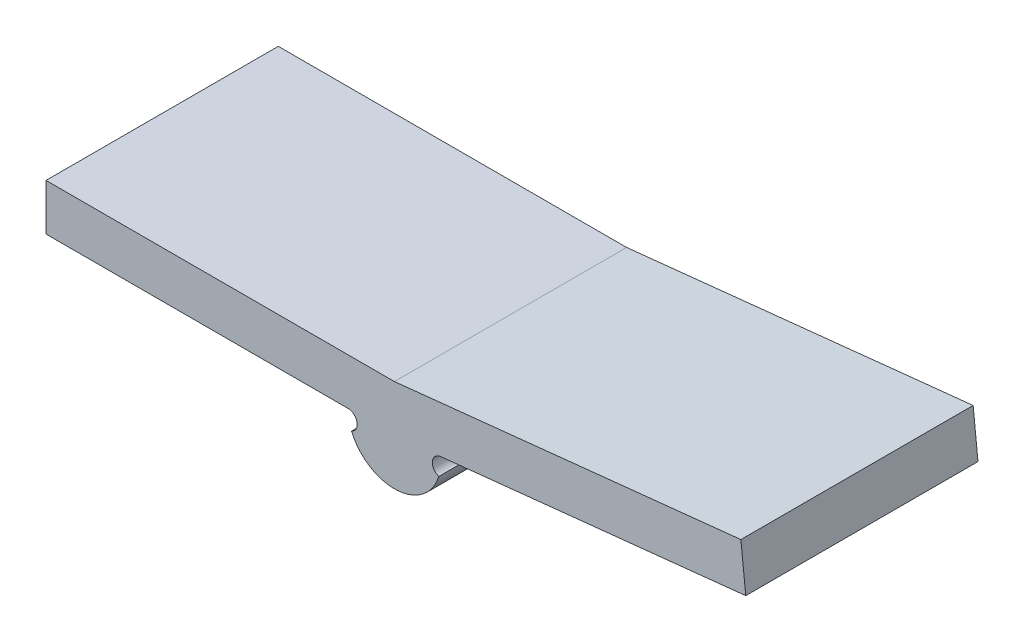
ISO-10303-21;
HEADER;
FILE_DESCRIPTION(('STEP AP214'),'2;1');
FILE_NAME('part.step','',(''),(''),'','','');
FILE_SCHEMA(('AUTOMOTIVE_DESIGN { 1 0 10303 214 1 1 1 1 }'));
ENDSEC;
DATA;
#1=APPLICATION_CONTEXT('core data for automotive mechanical design processes');
#2=APPLICATION_PROTOCOL_DEFINITION('international standard','automotive_design',2000,#1);
#3=PRODUCT_CONTEXT('',#1,'mechanical');
#4=PRODUCT('Part','Part','',(#3));
#5=PRODUCT_RELATED_PRODUCT_CATEGORY('part','',(#4));
#6=PRODUCT_DEFINITION_FORMATION('','',#4);
#7=PRODUCT_DEFINITION_CONTEXT('part definition',#1,'design');
#8=PRODUCT_DEFINITION('design','',#6,#7);
#9=PRODUCT_DEFINITION_SHAPE('','',#8);
#10=(LENGTH_UNIT() NAMED_UNIT(*) SI_UNIT(.MILLI.,.METRE.));
#11=(NAMED_UNIT(*) PLANE_ANGLE_UNIT() SI_UNIT($,.RADIAN.));
#12=(NAMED_UNIT(*) SI_UNIT($,.STERADIAN.) SOLID_ANGLE_UNIT());
#13=UNCERTAINTY_MEASURE_WITH_UNIT(LENGTH_MEASURE(1.E-05),#10,'distance_accuracy_value','');
#14=(GEOMETRIC_REPRESENTATION_CONTEXT(3) GLOBAL_UNCERTAINTY_ASSIGNED_CONTEXT((#13)) GLOBAL_UNIT_ASSIGNED_CONTEXT((#10,
#11,#12)) REPRESENTATION_CONTEXT('',''));
#15=CARTESIAN_POINT('',(0.,0.,0.));
#16=DIRECTION('',(0.,0.,1.));
#17=DIRECTION('',(1.,0.,0.));
#18=AXIS2_PLACEMENT_3D('',#15,#16,#17);
#19=CARTESIAN_POINT('',(-133.871822526404,4.83943403485171,50.));
#20=DIRECTION('',(1.,0.,0.));
#21=DIRECTION('',(0.,1.,0.));
#22=AXIS2_PLACEMENT_3D('',#19,#20,#21);
#23=PLANE('',#22);
#24=DIRECTION('',(0.,-1.,0.));
#25=VECTOR('',#24,1.);
#26=CARTESIAN_POINT('',(-133.871822526404,4.83943403485171,0.));
#27=LINE('',#26,#25);
#28=CARTESIAN_POINT('',(-133.871822526404,14.8394340348517,0.));
#29=VERTEX_POINT('',#28);
#30=CARTESIAN_POINT('',(-133.871822526404,4.83943403485171,0.));
#31=VERTEX_POINT('',#30);
#32=EDGE_CURVE('E129',#29,#31,#27,.T.);
#33=ORIENTED_EDGE('',*,*,#32,.T.);
#34=DIRECTION('',(0.,0.,-1.));
#35=VECTOR('',#34,1.);
#36=CARTESIAN_POINT('',(-133.871822526404,4.83943403485171,50.));
#37=LINE('',#36,#35);
#38=CARTESIAN_POINT('',(-133.871822526404,4.83943403485171,50.));
#39=VERTEX_POINT('',#38);
#40=EDGE_CURVE('E40',#39,#31,#37,.T.);
#41=ORIENTED_EDGE('',*,*,#40,.F.);
#42=DIRECTION('',(0.,-1.,0.));
#43=VECTOR('',#42,1.);
#44=CARTESIAN_POINT('',(-133.871822526404,4.83943403485171,50.));
#45=LINE('',#44,#43);
#46=CARTESIAN_POINT('',(-133.871822526404,14.8394340348517,50.));
#47=VERTEX_POINT('',#46);
#48=EDGE_CURVE('E145',#47,#39,#45,.T.);
#49=ORIENTED_EDGE('',*,*,#48,.F.);
#50=DIRECTION('',(0.,0.,-1.));
#51=VECTOR('',#50,1.);
#52=CARTESIAN_POINT('',(-133.871822526404,14.8394340348517,50.));
#53=LINE('',#52,#51);
#54=EDGE_CURVE('E125',#47,#29,#53,.T.);
#55=ORIENTED_EDGE('',*,*,#54,.T.);
#56=EDGE_LOOP('',(#33,#41,#49,#55));
#57=FACE_BOUND('',#56,.T.);
#58=ADVANCED_FACE('F33',(#57),#23,.F.);
#59=CARTESIAN_POINT('',(-68.8718225264042,4.8394340348522,50.));
#60=DIRECTION('',(0.,1.,0.));
#61=DIRECTION('',(-1.,0.,0.));
#62=AXIS2_PLACEMENT_3D('',#59,#60,#61);
#63=PLANE('',#62);
#64=DIRECTION('',(1.,0.,0.));
#65=VECTOR('',#64,1.);
#66=CARTESIAN_POINT('',(-68.8718225264042,4.8394340348522,0.));
#67=LINE('',#66,#65);
#68=CARTESIAN_POINT('',(-68.8718225264042,4.8394340348522,0.));
#69=VERTEX_POINT('',#68);
#70=EDGE_CURVE('E132',#31,#69,#67,.T.);
#71=ORIENTED_EDGE('',*,*,#70,.T.);
#72=DIRECTION('',(0.,0.,-1.));
#73=VECTOR('',#72,1.);
#74=CARTESIAN_POINT('',(-68.8718225264042,4.8394340348522,50.));
#75=LINE('',#74,#73);
#76=CARTESIAN_POINT('',(-68.871822526404,4.83943403485219,50.));
#77=VERTEX_POINT('',#76);
#78=EDGE_CURVE('E152',#77,#69,#75,.T.);
#79=ORIENTED_EDGE('',*,*,#78,.F.);
#80=DIRECTION('',(1.,0.,0.));
#81=VECTOR('',#80,1.);
#82=CARTESIAN_POINT('',(-68.8718225264042,4.8394340348522,50.));
#83=LINE('',#82,#81);
#84=EDGE_CURVE('E92',#39,#77,#83,.T.);
#85=ORIENTED_EDGE('',*,*,#84,.F.);
#86=ORIENTED_EDGE('',*,*,#40,.T.);
#87=EDGE_LOOP('',(#71,#79,#85,#86));
#88=FACE_BOUND('',#87,.T.);
#89=ADVANCED_FACE('F154',(#88),#63,.F.);
#90=CARTESIAN_POINT('',(-58.8718225264042,4.83943403485171,50.));
#91=DIRECTION('',(0.,0.,-1.));
#92=DIRECTION('',(-1.,0.,0.));
#93=AXIS2_PLACEMENT_3D('',#90,#91,#92);
#94=CYLINDRICAL_SURFACE('',#93,9.99999999999994);
#95=CARTESIAN_POINT('',(-58.8718225264042,4.83943403485171,50.));
#96=DIRECTION('',(0.,0.,1.));
#97=DIRECTION('',(1.,0.,0.));
#98=AXIS2_PLACEMENT_3D('',#95,#96,#97);
#99=CIRCLE('',#98,9.99999999999994);
#100=CARTESIAN_POINT('',(-68.1025917571735,0.993280188698207,50.));
#101=VERTEX_POINT('',#100);
#102=CARTESIAN_POINT('',(-49.3041581518589,1.93086077360232,50.));
#103=VERTEX_POINT('',#102);
#104=EDGE_CURVE('E172',#101,#103,#99,.T.);
#105=ORIENTED_EDGE('',*,*,#104,.F.);
#106=DIRECTION('',(0.,0.,1.));
#107=VECTOR('',#106,1.);
#108=CARTESIAN_POINT('',(-68.1025917571735,0.993280188698207,25.));
#109=LINE('',#108,#107);
#110=CARTESIAN_POINT('',(-68.1025917571735,0.993280188698207,0.));
#111=VERTEX_POINT('',#110);
#112=EDGE_CURVE('E133',#101,#111,#109,.F.);
#113=ORIENTED_EDGE('',*,*,#112,.T.);
#114=CARTESIAN_POINT('',(-58.8718225264042,4.83943403485171,0.));
#115=DIRECTION('',(0.,0.,1.));
#116=DIRECTION('',(1.,0.,0.));
#117=AXIS2_PLACEMENT_3D('',#114,#115,#116);
#118=CIRCLE('',#117,9.99999999999994);
#119=CARTESIAN_POINT('',(-49.3041581518589,1.93086077360232,0.));
#120=VERTEX_POINT('',#119);
#121=EDGE_CURVE('E136',#111,#120,#118,.T.);
#122=ORIENTED_EDGE('',*,*,#121,.T.);
#123=DIRECTION('',(0.,0.,1.));
#124=VECTOR('',#123,1.);
#125=CARTESIAN_POINT('',(-49.3041581518589,1.93086077360232,25.));
#126=LINE('',#125,#124);
#127=EDGE_CURVE('E47',#120,#103,#126,.T.);
#128=ORIENTED_EDGE('',*,*,#127,.T.);
#129=EDGE_LOOP('',(#105,#113,#122,#128));
#130=FACE_BOUND('',#129,.T.);
#131=ADVANCED_FACE('F170',(#130),#94,.T.);
#132=CARTESIAN_POINT('',(16.7626042588928,12.733849826243,50.));
#133=DIRECTION('',(-0.104528463267647,0.994521895368274,0.));
#134=DIRECTION('',(-0.994521895368274,-0.104528463267647,0.));
#135=AXIS2_PLACEMENT_3D('',#132,#133,#134);
#136=PLANE('',#135);
#137=DIRECTION('',(0.994521895368274,0.104528463267647,0.));
#138=VECTOR('',#137,1.);
#139=CARTESIAN_POINT('',(16.7626042588928,12.733849826243,0.));
#140=LINE('',#139,#138);
#141=CARTESIAN_POINT('',(-48.9210266214258,5.83022203309462,0.));
#142=VERTEX_POINT('',#141);
#143=CARTESIAN_POINT('',(16.7626042588928,12.733849826243,0.));
#144=VERTEX_POINT('',#143);
#145=EDGE_CURVE('E139',#142,#144,#140,.T.);
#146=ORIENTED_EDGE('',*,*,#145,.T.);
#147=DIRECTION('',(0.,0.,-1.));
#148=VECTOR('',#147,1.);
#149=CARTESIAN_POINT('',(16.7626042588928,12.733849826243,50.));
#150=LINE('',#149,#148);
#151=CARTESIAN_POINT('',(16.7626042588928,12.733849826243,50.));
#152=VERTEX_POINT('',#151);
#153=EDGE_CURVE('E120',#152,#144,#150,.T.);
#154=ORIENTED_EDGE('',*,*,#153,.F.);
#155=DIRECTION('',(0.994521895368274,0.104528463267647,0.));
#156=VECTOR('',#155,1.);
#157=CARTESIAN_POINT('',(16.7626042588928,12.733849826243,50.));
#158=LINE('',#157,#156);
#159=CARTESIAN_POINT('',(-48.9210266214258,5.83022203309462,50.));
#160=VERTEX_POINT('',#159);
#161=EDGE_CURVE('E108',#160,#152,#158,.T.);
#162=ORIENTED_EDGE('',*,*,#161,.F.);
#163=DIRECTION('',(0.,0.,-1.));
#164=VECTOR('',#163,1.);
#165=CARTESIAN_POINT('',(-48.9210266214258,5.83022203309462,50.));
#166=LINE('',#165,#164);
#167=EDGE_CURVE('E149',#160,#142,#166,.T.);
#168=ORIENTED_EDGE('',*,*,#167,.T.);
#169=EDGE_LOOP('',(#146,#154,#162,#168));
#170=FACE_BOUND('',#169,.T.);
#171=ADVANCED_FACE('F195',(#170),#136,.F.);
#172=CARTESIAN_POINT('',(15.7173196262163,22.6790687799258,50.));
#173=DIRECTION('',(-0.994521895368274,-0.104528463267652,0.));
#174=DIRECTION('',(0.104528463267652,-0.994521895368274,0.));
#175=AXIS2_PLACEMENT_3D('',#172,#173,#174);
#176=PLANE('',#175);
#177=DIRECTION('',(-0.104528463267652,0.994521895368274,0.));
#178=VECTOR('',#177,1.);
#179=CARTESIAN_POINT('',(15.7173196262163,22.6790687799258,0.));
#180=LINE('',#179,#178);
#181=CARTESIAN_POINT('',(15.7173196262163,22.6790687799258,0.));
#182=VERTEX_POINT('',#181);
#183=EDGE_CURVE('E117',#144,#182,#180,.T.);
#184=ORIENTED_EDGE('',*,*,#183,.T.);
#185=DIRECTION('',(0.,0.,-1.));
#186=VECTOR('',#185,1.);
#187=CARTESIAN_POINT('',(15.7173196262163,22.6790687799258,50.));
#188=LINE('',#187,#186);
#189=CARTESIAN_POINT('',(15.7173196262163,22.6790687799258,50.));
#190=VERTEX_POINT('',#189);
#191=EDGE_CURVE('E114',#190,#182,#188,.T.);
#192=ORIENTED_EDGE('',*,*,#191,.F.);
#193=DIRECTION('',(-0.104528463267652,0.994521895368274,0.));
#194=VECTOR('',#193,1.);
#195=CARTESIAN_POINT('',(15.7173196262163,22.6790687799258,50.));
#196=LINE('',#195,#194);
#197=EDGE_CURVE('E99',#152,#190,#196,.T.);
#198=ORIENTED_EDGE('',*,*,#197,.F.);
#199=ORIENTED_EDGE('',*,*,#153,.T.);
#200=EDGE_LOOP('',(#184,#192,#198,#199));
#201=FACE_BOUND('',#200,.T.);
#202=ADVANCED_FACE('F115',(#201),#176,.F.);
#203=CARTESIAN_POINT('',(-58.8718225264042,14.8394340348517,50.));
#204=DIRECTION('',(0.104528463267654,-0.994521895368273,0.));
#205=DIRECTION('',(0.994521895368273,0.104528463267654,0.));
#206=AXIS2_PLACEMENT_3D('',#203,#204,#205);
#207=PLANE('',#206);
#208=DIRECTION('',(-0.994521895368273,-0.104528463267654,0.));
#209=VECTOR('',#208,1.);
#210=CARTESIAN_POINT('',(-58.8718225264042,14.8394340348517,0.));
#211=LINE('',#210,#209);
#212=CARTESIAN_POINT('',(-58.8718225264042,14.8394340348517,0.));
#213=VERTEX_POINT('',#212);
#214=EDGE_CURVE('E142',#182,#213,#211,.T.);
#215=ORIENTED_EDGE('',*,*,#214,.T.);
#216=DIRECTION('',(0.,0.,-1.));
#217=VECTOR('',#216,1.);
#218=CARTESIAN_POINT('',(-58.8718225264042,14.8394340348517,50.));
#219=LINE('',#218,#217);
#220=CARTESIAN_POINT('',(-58.8718225264042,14.8394340348517,50.));
#221=VERTEX_POINT('',#220);
#222=EDGE_CURVE('E121',#221,#213,#219,.T.);
#223=ORIENTED_EDGE('',*,*,#222,.F.);
#224=DIRECTION('',(-0.994521895368273,-0.104528463267654,0.));
#225=VECTOR('',#224,1.);
#226=CARTESIAN_POINT('',(-58.8718225264042,14.8394340348517,50.));
#227=LINE('',#226,#225);
#228=EDGE_CURVE('E104',#190,#221,#227,.T.);
#229=ORIENTED_EDGE('',*,*,#228,.F.);
#230=ORIENTED_EDGE('',*,*,#191,.T.);
#231=EDGE_LOOP('',(#215,#223,#229,#230));
#232=FACE_BOUND('',#231,.T.);
#233=ADVANCED_FACE('F123',(#232),#207,.F.);
#234=CARTESIAN_POINT('',(-133.871822526404,14.8394340348517,50.));
#235=DIRECTION('',(0.,-1.,0.));
#236=DIRECTION('',(0.,0.,-1.));
#237=AXIS2_PLACEMENT_3D('',#234,#235,#236);
#238=PLANE('',#237);
#239=DIRECTION('',(-1.,0.,0.));
#240=VECTOR('',#239,1.);
#241=CARTESIAN_POINT('',(-133.871822526404,14.8394340348517,0.));
#242=LINE('',#241,#240);
#243=EDGE_CURVE('E83',#213,#29,#242,.T.);
#244=ORIENTED_EDGE('',*,*,#243,.T.);
#245=ORIENTED_EDGE('',*,*,#54,.F.);
#246=DIRECTION('',(-1.,0.,0.));
#247=VECTOR('',#246,1.);
#248=CARTESIAN_POINT('',(-133.871822526404,14.8394340348517,50.));
#249=LINE('',#248,#247);
#250=EDGE_CURVE('E56',#221,#47,#249,.T.);
#251=ORIENTED_EDGE('',*,*,#250,.F.);
#252=ORIENTED_EDGE('',*,*,#222,.T.);
#253=EDGE_LOOP('',(#244,#245,#251,#252));
#254=FACE_BOUND('',#253,.T.);
#255=ADVANCED_FACE('F196',(#254),#238,.F.);
#256=CARTESIAN_POINT('',(-58.8718225264042,4.83943403485171,50.));
#257=DIRECTION('',(0.,0.,1.));
#258=DIRECTION('',(1.,0.,0.));
#259=AXIS2_PLACEMENT_3D('',#256,#257,#258);
#260=PLANE('',#259);
#261=CARTESIAN_POINT('',(-68.871822526404,2.83943403485219,50.));
#262=DIRECTION('',(0.,0.,1.));
#263=DIRECTION('',(1.,0.,0.));
#264=AXIS2_PLACEMENT_3D('',#261,#262,#263);
#265=CIRCLE('',#264,2.);
#266=EDGE_CURVE('E174',#101,#77,#265,.T.);
#267=ORIENTED_EDGE('',*,*,#266,.F.);
#268=ORIENTED_EDGE('',*,*,#104,.T.);
#269=CARTESIAN_POINT('',(-48.7119696948905,3.84117824235807,50.));
#270=DIRECTION('',(0.,0.,1.));
#271=DIRECTION('',(-1.,0.,0.));
#272=AXIS2_PLACEMENT_3D('',#269,#270,#271);
#273=CIRCLE('',#272,2.);
#274=EDGE_CURVE('E182',#160,#103,#273,.T.);
#275=ORIENTED_EDGE('',*,*,#274,.F.);
#276=ORIENTED_EDGE('',*,*,#161,.T.);
#277=ORIENTED_EDGE('',*,*,#197,.T.);
#278=ORIENTED_EDGE('',*,*,#228,.T.);
#279=ORIENTED_EDGE('',*,*,#250,.T.);
#280=ORIENTED_EDGE('',*,*,#48,.T.);
#281=ORIENTED_EDGE('',*,*,#84,.T.);
#282=EDGE_LOOP('',(#267,#268,#275,#276,#277,#278,#279,#280,#281));
#283=FACE_BOUND('',#282,.T.);
#284=ADVANCED_FACE('F102',(#283),#260,.T.);
#285=CARTESIAN_POINT('',(-58.8718225264042,4.83943403485171,0.));
#286=DIRECTION('',(0.,0.,1.));
#287=DIRECTION('',(1.,0.,0.));
#288=AXIS2_PLACEMENT_3D('',#285,#286,#287);
#289=PLANE('',#288);
#290=ORIENTED_EDGE('',*,*,#121,.F.);
#291=CARTESIAN_POINT('',(-68.871822526404,2.83943403485219,0.));
#292=DIRECTION('',(0.,0.,1.));
#293=DIRECTION('',(1.,0.,0.));
#294=AXIS2_PLACEMENT_3D('',#291,#292,#293);
#295=CIRCLE('',#294,2.);
#296=EDGE_CURVE('E11',#111,#69,#295,.T.);
#297=ORIENTED_EDGE('',*,*,#296,.T.);
#298=ORIENTED_EDGE('',*,*,#70,.F.);
#299=ORIENTED_EDGE('',*,*,#32,.F.);
#300=ORIENTED_EDGE('',*,*,#243,.F.);
#301=ORIENTED_EDGE('',*,*,#214,.F.);
#302=ORIENTED_EDGE('',*,*,#183,.F.);
#303=ORIENTED_EDGE('',*,*,#145,.F.);
#304=CARTESIAN_POINT('',(-48.7119696948905,3.84117824235807,0.));
#305=DIRECTION('',(0.,0.,1.));
#306=DIRECTION('',(-1.,0.,0.));
#307=AXIS2_PLACEMENT_3D('',#304,#305,#306);
#308=CIRCLE('',#307,2.);
#309=EDGE_CURVE('E190',#142,#120,#308,.T.);
#310=ORIENTED_EDGE('',*,*,#309,.T.);
#311=EDGE_LOOP('',(#290,#297,#298,#299,#300,#301,#302,#303,#310));
#312=FACE_BOUND('',#311,.T.);
#313=ADVANCED_FACE('F160',(#312),#289,.F.);
#314=CARTESIAN_POINT('',(-48.7119696948905,3.84117824235807,0.));
#315=DIRECTION('',(0.,0.,1.));
#316=DIRECTION('',(1.,0.,0.));
#317=AXIS2_PLACEMENT_3D('',#314,#315,#316);
#318=CYLINDRICAL_SURFACE('',#317,2.);
#319=ORIENTED_EDGE('',*,*,#309,.F.);
#320=ORIENTED_EDGE('',*,*,#167,.F.);
#321=ORIENTED_EDGE('',*,*,#274,.T.);
#322=ORIENTED_EDGE('',*,*,#127,.F.);
#323=EDGE_LOOP('',(#319,#320,#321,#322));
#324=FACE_BOUND('',#323,.T.);
#325=ADVANCED_FACE('F191',(#324),#318,.F.);
#326=CARTESIAN_POINT('',(-68.871822526404,2.83943403485219,0.));
#327=DIRECTION('',(0.,0.,1.));
#328=DIRECTION('',(1.,0.,0.));
#329=AXIS2_PLACEMENT_3D('',#326,#327,#328);
#330=CYLINDRICAL_SURFACE('',#329,2.);
#331=ORIENTED_EDGE('',*,*,#266,.T.);
#332=ORIENTED_EDGE('',*,*,#78,.T.);
#333=ORIENTED_EDGE('',*,*,#296,.F.);
#334=ORIENTED_EDGE('',*,*,#112,.F.);
#335=EDGE_LOOP('',(#331,#332,#333,#334));
#336=FACE_BOUND('',#335,.T.);
#337=ADVANCED_FACE('F166',(#336),#330,.F.);
#338=CLOSED_SHELL('',(#58,#89,#131,#171,#202,#233,#255,#284,#313,#325,#337));
#339=MANIFOLD_SOLID_BREP('B2',#338);
#340=ADVANCED_BREP_SHAPE_REPRESENTATION('',(#18,#339),#14);
#341=SHAPE_DEFINITION_REPRESENTATION(#9,#340);
ENDSEC;
END-ISO-10303-21;
